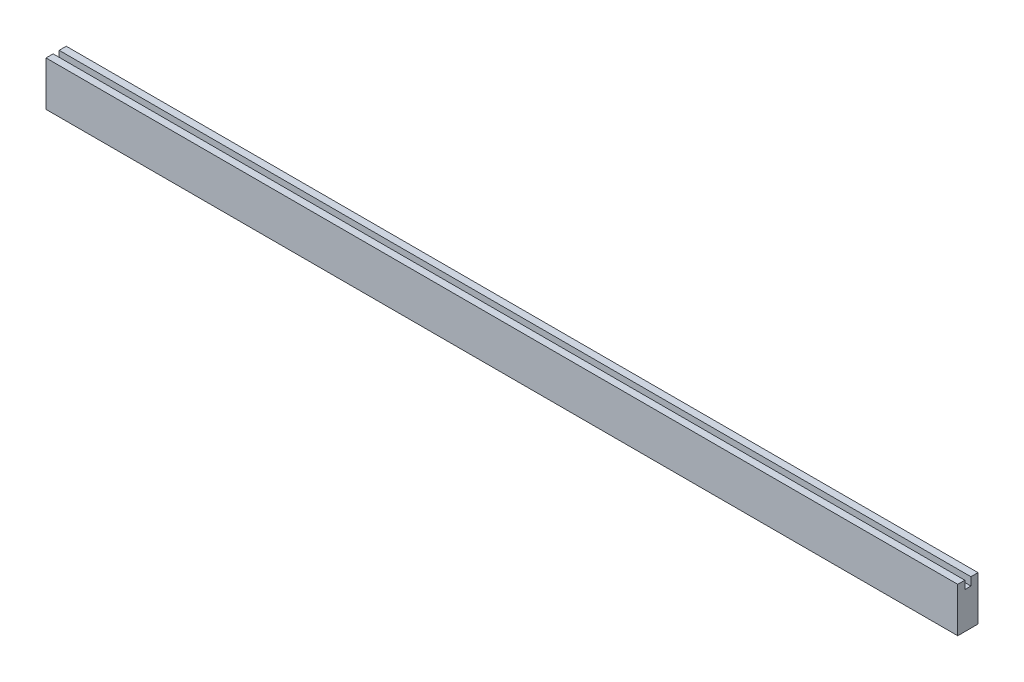
ISO-10303-21;
HEADER;
FILE_DESCRIPTION(('STEP AP214'),'2;1');
FILE_NAME('part.step','',(''),(''),'','','');
FILE_SCHEMA(('AUTOMOTIVE_DESIGN { 1 0 10303 214 1 1 1 1 }'));
ENDSEC;
DATA;
#1=APPLICATION_CONTEXT('core data for automotive mechanical design processes');
#2=APPLICATION_PROTOCOL_DEFINITION('international standard','automotive_design',2000,#1);
#3=PRODUCT_CONTEXT('',#1,'mechanical');
#4=PRODUCT('Part','Part','',(#3));
#5=PRODUCT_RELATED_PRODUCT_CATEGORY('part','',(#4));
#6=PRODUCT_DEFINITION_FORMATION('','',#4);
#7=PRODUCT_DEFINITION_CONTEXT('part definition',#1,'design');
#8=PRODUCT_DEFINITION('design','',#6,#7);
#9=PRODUCT_DEFINITION_SHAPE('','',#8);
#10=(LENGTH_UNIT() NAMED_UNIT(*) SI_UNIT(.MILLI.,.METRE.));
#11=(NAMED_UNIT(*) PLANE_ANGLE_UNIT() SI_UNIT($,.RADIAN.));
#12=(NAMED_UNIT(*) SI_UNIT($,.STERADIAN.) SOLID_ANGLE_UNIT());
#13=UNCERTAINTY_MEASURE_WITH_UNIT(LENGTH_MEASURE(1.E-05),#10,'distance_accuracy_value','');
#14=(GEOMETRIC_REPRESENTATION_CONTEXT(3) GLOBAL_UNCERTAINTY_ASSIGNED_CONTEXT((#13)) GLOBAL_UNIT_ASSIGNED_CONTEXT((#10,
#11,#12)) REPRESENTATION_CONTEXT('',''));
#15=CARTESIAN_POINT('',(0.,0.,0.));
#16=DIRECTION('',(0.,0.,1.));
#17=DIRECTION('',(1.,0.,0.));
#18=AXIS2_PLACEMENT_3D('',#15,#16,#17);
#19=CARTESIAN_POINT('',(0.,22.,0.));
#20=DIRECTION('',(0.,-1.,0.));
#21=DIRECTION('',(0.,0.,-1.));
#22=AXIS2_PLACEMENT_3D('',#19,#20,#21);
#23=PLANE('',#22);
#24=DIRECTION('',(0.,0.,1.));
#25=VECTOR('',#24,1.);
#26=CARTESIAN_POINT('',(-247.623576346524,22.,0.));
#27=LINE('',#26,#25);
#28=CARTESIAN_POINT('',(-247.623576346524,22.,-10.));
#29=VERTEX_POINT('',#28);
#30=CARTESIAN_POINT('',(-247.623576346524,22.,-6.5));
#31=VERTEX_POINT('',#30);
#32=EDGE_CURVE('E163',#29,#31,#27,.T.);
#33=ORIENTED_EDGE('',*,*,#32,.T.);
#34=DIRECTION('',(-1.,0.,0.));
#35=VECTOR('',#34,1.);
#36=CARTESIAN_POINT('',(-247.623576346524,22.,-6.5));
#37=LINE('',#36,#35);
#38=CARTESIAN_POINT('',(202.376423653476,22.,-6.5));
#39=VERTEX_POINT('',#38);
#40=EDGE_CURVE('E143',#39,#31,#37,.T.);
#41=ORIENTED_EDGE('',*,*,#40,.F.);
#42=DIRECTION('',(0.,0.,-1.));
#43=VECTOR('',#42,1.);
#44=CARTESIAN_POINT('',(202.376423653476,22.,0.));
#45=LINE('',#44,#43);
#46=CARTESIAN_POINT('',(202.376423653476,22.,-10.));
#47=VERTEX_POINT('',#46);
#48=EDGE_CURVE('E167',#39,#47,#45,.T.);
#49=ORIENTED_EDGE('',*,*,#48,.T.);
#50=DIRECTION('',(-1.,0.,0.));
#51=VECTOR('',#50,1.);
#52=CARTESIAN_POINT('',(-247.623576346524,22.,-10.));
#53=LINE('',#52,#51);
#54=EDGE_CURVE('E62',#47,#29,#53,.T.);
#55=ORIENTED_EDGE('',*,*,#54,.T.);
#56=EDGE_LOOP('',(#33,#41,#49,#55));
#57=FACE_BOUND('',#56,.T.);
#58=ADVANCED_FACE('F38',(#57),#23,.F.);
#59=CARTESIAN_POINT('',(-247.623576346524,22.,0.));
#60=DIRECTION('',(1.,0.,0.));
#61=DIRECTION('',(0.,0.,-1.));
#62=AXIS2_PLACEMENT_3D('',#59,#60,#61);
#63=PLANE('',#62);
#64=DIRECTION('',(0.,0.,1.));
#65=VECTOR('',#64,1.);
#66=CARTESIAN_POINT('',(-247.623576346524,18.,-6.5));
#67=LINE('',#66,#65);
#68=CARTESIAN_POINT('',(-247.623576346524,18.,-6.5));
#69=VERTEX_POINT('',#68);
#70=CARTESIAN_POINT('',(-247.623576346524,18.,-3.5));
#71=VERTEX_POINT('',#70);
#72=EDGE_CURVE('E139',#69,#71,#67,.T.);
#73=ORIENTED_EDGE('',*,*,#72,.F.);
#74=DIRECTION('',(0.,1.,0.));
#75=VECTOR('',#74,1.);
#76=CARTESIAN_POINT('',(-247.623576346524,18.,-6.5));
#77=LINE('',#76,#75);
#78=EDGE_CURVE('E153',#69,#31,#77,.T.);
#79=ORIENTED_EDGE('',*,*,#78,.T.);
#80=ORIENTED_EDGE('',*,*,#32,.F.);
#81=DIRECTION('',(0.,-1.,0.));
#82=VECTOR('',#81,1.);
#83=CARTESIAN_POINT('',(-247.623576346524,22.,-10.));
#84=LINE('',#83,#82);
#85=CARTESIAN_POINT('',(-247.623576346524,0.,-10.));
#86=VERTEX_POINT('',#85);
#87=EDGE_CURVE('E172',#29,#86,#84,.T.);
#88=ORIENTED_EDGE('',*,*,#87,.T.);
#89=DIRECTION('',(0.,0.,1.));
#90=VECTOR('',#89,1.);
#91=CARTESIAN_POINT('',(-247.623576346524,0.,0.));
#92=LINE('',#91,#90);
#93=CARTESIAN_POINT('',(-247.623576346524,0.,0.));
#94=VERTEX_POINT('',#93);
#95=EDGE_CURVE('E156',#86,#94,#92,.T.);
#96=ORIENTED_EDGE('',*,*,#95,.T.);
#97=DIRECTION('',(0.,-1.,0.));
#98=VECTOR('',#97,1.);
#99=CARTESIAN_POINT('',(-247.623576346524,22.,0.));
#100=LINE('',#99,#98);
#101=CARTESIAN_POINT('',(-247.623576346524,22.,0.));
#102=VERTEX_POINT('',#101);
#103=EDGE_CURVE('E11',#102,#94,#100,.T.);
#104=ORIENTED_EDGE('',*,*,#103,.F.);
#105=CARTESIAN_POINT('',(-247.623576346524,22.,-3.5));
#106=VERTEX_POINT('',#105);
#107=EDGE_CURVE('E90',#106,#102,#27,.T.);
#108=ORIENTED_EDGE('',*,*,#107,.F.);
#109=DIRECTION('',(0.,1.,0.));
#110=VECTOR('',#109,1.);
#111=CARTESIAN_POINT('',(-247.623576346524,18.,-3.5));
#112=LINE('',#111,#110);
#113=EDGE_CURVE('E53',#71,#106,#112,.T.);
#114=ORIENTED_EDGE('',*,*,#113,.F.);
#115=EDGE_LOOP('',(#73,#79,#80,#88,#96,#104,#108,#114));
#116=FACE_BOUND('',#115,.T.);
#117=ADVANCED_FACE('F40',(#116),#63,.F.);
#118=CARTESIAN_POINT('',(-247.623576346524,22.,0.));
#119=DIRECTION('',(0.,0.,-1.));
#120=DIRECTION('',(-1.,0.,0.));
#121=AXIS2_PLACEMENT_3D('',#118,#119,#120);
#122=PLANE('',#121);
#123=DIRECTION('',(1.,0.,0.));
#124=VECTOR('',#123,1.);
#125=CARTESIAN_POINT('',(-247.623576346524,0.,0.));
#126=LINE('',#125,#124);
#127=CARTESIAN_POINT('',(202.376423653476,0.,0.));
#128=VERTEX_POINT('',#127);
#129=EDGE_CURVE('E175',#94,#128,#126,.T.);
#130=ORIENTED_EDGE('',*,*,#129,.T.);
#131=DIRECTION('',(0.,-1.,0.));
#132=VECTOR('',#131,1.);
#133=CARTESIAN_POINT('',(202.376423653476,22.,0.));
#134=LINE('',#133,#132);
#135=CARTESIAN_POINT('',(202.376423653476,22.,0.));
#136=VERTEX_POINT('',#135);
#137=EDGE_CURVE('E46',#136,#128,#134,.T.);
#138=ORIENTED_EDGE('',*,*,#137,.F.);
#139=DIRECTION('',(1.,0.,0.));
#140=VECTOR('',#139,1.);
#141=CARTESIAN_POINT('',(-247.623576346524,22.,0.));
#142=LINE('',#141,#140);
#143=EDGE_CURVE('E165',#102,#136,#142,.T.);
#144=ORIENTED_EDGE('',*,*,#143,.F.);
#145=ORIENTED_EDGE('',*,*,#103,.T.);
#146=EDGE_LOOP('',(#130,#138,#144,#145));
#147=FACE_BOUND('',#146,.T.);
#148=ADVANCED_FACE('F208',(#147),#122,.F.);
#149=CARTESIAN_POINT('',(202.376423653476,22.,0.));
#150=DIRECTION('',(-1.,0.,0.));
#151=DIRECTION('',(0.,0.,1.));
#152=AXIS2_PLACEMENT_3D('',#149,#150,#151);
#153=PLANE('',#152);
#154=ORIENTED_EDGE('',*,*,#48,.F.);
#155=DIRECTION('',(0.,1.,0.));
#156=VECTOR('',#155,1.);
#157=CARTESIAN_POINT('',(202.376423653476,18.,-6.5));
#158=LINE('',#157,#156);
#159=CARTESIAN_POINT('',(202.376423653476,18.,-6.5));
#160=VERTEX_POINT('',#159);
#161=EDGE_CURVE('E157',#160,#39,#158,.T.);
#162=ORIENTED_EDGE('',*,*,#161,.F.);
#163=DIRECTION('',(0.,0.,-1.));
#164=VECTOR('',#163,1.);
#165=CARTESIAN_POINT('',(202.376423653476,18.,-6.5));
#166=LINE('',#165,#164);
#167=CARTESIAN_POINT('',(202.376423653476,18.,-3.5));
#168=VERTEX_POINT('',#167);
#169=EDGE_CURVE('E146',#168,#160,#166,.T.);
#170=ORIENTED_EDGE('',*,*,#169,.F.);
#171=DIRECTION('',(0.,1.,0.));
#172=VECTOR('',#171,1.);
#173=CARTESIAN_POINT('',(202.376423653476,18.,-3.5));
#174=LINE('',#173,#172);
#175=CARTESIAN_POINT('',(202.376423653476,22.,-3.5));
#176=VERTEX_POINT('',#175);
#177=EDGE_CURVE('E159',#168,#176,#174,.T.);
#178=ORIENTED_EDGE('',*,*,#177,.T.);
#179=EDGE_CURVE('E168',#136,#176,#45,.T.);
#180=ORIENTED_EDGE('',*,*,#179,.F.);
#181=ORIENTED_EDGE('',*,*,#137,.T.);
#182=DIRECTION('',(0.,0.,-1.));
#183=VECTOR('',#182,1.);
#184=CARTESIAN_POINT('',(202.376423653476,0.,0.));
#185=LINE('',#184,#183);
#186=CARTESIAN_POINT('',(202.376423653476,0.,-10.));
#187=VERTEX_POINT('',#186);
#188=EDGE_CURVE('E177',#128,#187,#185,.T.);
#189=ORIENTED_EDGE('',*,*,#188,.T.);
#190=DIRECTION('',(0.,-1.,0.));
#191=VECTOR('',#190,1.);
#192=CARTESIAN_POINT('',(202.376423653476,22.,-10.));
#193=LINE('',#192,#191);
#194=EDGE_CURVE('E181',#47,#187,#193,.T.);
#195=ORIENTED_EDGE('',*,*,#194,.F.);
#196=EDGE_LOOP('',(#154,#162,#170,#178,#180,#181,#189,#195));
#197=FACE_BOUND('',#196,.T.);
#198=ADVANCED_FACE('F188',(#197),#153,.F.);
#199=CARTESIAN_POINT('',(-247.623576346524,22.,-10.));
#200=DIRECTION('',(0.,0.,1.));
#201=DIRECTION('',(1.,0.,0.));
#202=AXIS2_PLACEMENT_3D('',#199,#200,#201);
#203=PLANE('',#202);
#204=DIRECTION('',(-1.,0.,0.));
#205=VECTOR('',#204,1.);
#206=CARTESIAN_POINT('',(-247.623576346524,0.,-10.));
#207=LINE('',#206,#205);
#208=EDGE_CURVE('E83',#187,#86,#207,.T.);
#209=ORIENTED_EDGE('',*,*,#208,.T.);
#210=ORIENTED_EDGE('',*,*,#87,.F.);
#211=ORIENTED_EDGE('',*,*,#54,.F.);
#212=ORIENTED_EDGE('',*,*,#194,.T.);
#213=EDGE_LOOP('',(#209,#210,#211,#212));
#214=FACE_BOUND('',#213,.T.);
#215=ADVANCED_FACE('F198',(#214),#203,.F.);
#216=ORIENTED_EDGE('',*,*,#179,.T.);
#217=DIRECTION('',(1.,0.,0.));
#218=VECTOR('',#217,1.);
#219=CARTESIAN_POINT('',(-247.623576346524,22.,-3.5));
#220=LINE('',#219,#218);
#221=EDGE_CURVE('E138',#106,#176,#220,.T.);
#222=ORIENTED_EDGE('',*,*,#221,.F.);
#223=ORIENTED_EDGE('',*,*,#107,.T.);
#224=ORIENTED_EDGE('',*,*,#143,.T.);
#225=EDGE_LOOP('',(#216,#222,#223,#224));
#226=FACE_BOUND('',#225,.T.);
#227=ADVANCED_FACE('F207',(#226),#23,.F.);
#228=CARTESIAN_POINT('',(0.,0.,0.));
#229=DIRECTION('',(0.,-1.,0.));
#230=DIRECTION('',(0.,0.,-1.));
#231=AXIS2_PLACEMENT_3D('',#228,#229,#230);
#232=PLANE('',#231);
#233=CARTESIAN_POINT('',(77.3764236534756,0.,-4.99999999999978));
#234=DIRECTION('',(0.,-1.,0.));
#235=DIRECTION('',(0.,0.,-1.));
#236=AXIS2_PLACEMENT_3D('',#233,#234,#235);
#237=CIRCLE('',#236,1.49999999999999);
#238=CARTESIAN_POINT('',(77.3764236534756,0.,-6.49999999999977));
#239=VERTEX_POINT('',#238);
#240=EDGE_CURVE('E128',#239,#239,#237,.T.);
#241=ORIENTED_EDGE('',*,*,#240,.F.);
#242=EDGE_LOOP('',(#241));
#243=FACE_BOUND('',#242,.T.);
#244=CARTESIAN_POINT('',(-122.623576346524,0.,-4.99999999999978));
#245=DIRECTION('',(0.,-1.,0.));
#246=DIRECTION('',(0.,0.,-1.));
#247=AXIS2_PLACEMENT_3D('',#244,#245,#246);
#248=CIRCLE('',#247,1.49999999999999);
#249=CARTESIAN_POINT('',(-122.623576346524,0.,-6.49999999999977));
#250=VERTEX_POINT('',#249);
#251=EDGE_CURVE('E127',#250,#250,#248,.T.);
#252=ORIENTED_EDGE('',*,*,#251,.F.);
#253=EDGE_LOOP('',(#252));
#254=FACE_BOUND('',#253,.T.);
#255=ORIENTED_EDGE('',*,*,#95,.F.);
#256=ORIENTED_EDGE('',*,*,#208,.F.);
#257=ORIENTED_EDGE('',*,*,#188,.F.);
#258=ORIENTED_EDGE('',*,*,#129,.F.);
#259=EDGE_LOOP('',(#255,#256,#257,#258));
#260=FACE_BOUND('',#259,.T.);
#261=ADVANCED_FACE('F193',(#243,#254,#260),#232,.T.);
#262=CARTESIAN_POINT('',(-247.623576346524,18.,-6.5));
#263=DIRECTION('',(0.,0.,-1.));
#264=DIRECTION('',(-1.,0.,0.));
#265=AXIS2_PLACEMENT_3D('',#262,#263,#264);
#266=PLANE('',#265);
#267=ORIENTED_EDGE('',*,*,#40,.T.);
#268=ORIENTED_EDGE('',*,*,#78,.F.);
#269=DIRECTION('',(-1.,0.,0.));
#270=VECTOR('',#269,1.);
#271=CARTESIAN_POINT('',(-247.623576346524,18.,-6.5));
#272=LINE('',#271,#270);
#273=EDGE_CURVE('E148',#160,#69,#272,.T.);
#274=ORIENTED_EDGE('',*,*,#273,.F.);
#275=ORIENTED_EDGE('',*,*,#161,.T.);
#276=EDGE_LOOP('',(#267,#268,#274,#275));
#277=FACE_BOUND('',#276,.T.);
#278=ADVANCED_FACE('F203',(#277),#266,.F.);
#279=CARTESIAN_POINT('',(-247.623576346524,18.,-3.5));
#280=DIRECTION('',(0.,0.,1.));
#281=DIRECTION('',(1.,0.,0.));
#282=AXIS2_PLACEMENT_3D('',#279,#280,#281);
#283=PLANE('',#282);
#284=ORIENTED_EDGE('',*,*,#221,.T.);
#285=ORIENTED_EDGE('',*,*,#177,.F.);
#286=DIRECTION('',(1.,0.,0.));
#287=VECTOR('',#286,1.);
#288=CARTESIAN_POINT('',(-247.623576346524,18.,-3.5));
#289=LINE('',#288,#287);
#290=EDGE_CURVE('E142',#71,#168,#289,.T.);
#291=ORIENTED_EDGE('',*,*,#290,.F.);
#292=ORIENTED_EDGE('',*,*,#113,.T.);
#293=EDGE_LOOP('',(#284,#285,#291,#292));
#294=FACE_BOUND('',#293,.T.);
#295=ADVANCED_FACE('F252',(#294),#283,.F.);
#296=CARTESIAN_POINT('',(0.,18.,0.));
#297=DIRECTION('',(0.,1.,0.));
#298=DIRECTION('',(0.,0.,1.));
#299=AXIS2_PLACEMENT_3D('',#296,#297,#298);
#300=PLANE('',#299);
#301=ORIENTED_EDGE('',*,*,#72,.T.);
#302=ORIENTED_EDGE('',*,*,#290,.T.);
#303=ORIENTED_EDGE('',*,*,#169,.T.);
#304=ORIENTED_EDGE('',*,*,#273,.T.);
#305=EDGE_LOOP('',(#301,#302,#303,#304));
#306=FACE_BOUND('',#305,.T.);
#307=ADVANCED_FACE('F206',(#306),#300,.T.);
#308=CARTESIAN_POINT('',(-122.623576346524,10.,-4.99999999999978));
#309=DIRECTION('',(0.,-1.,0.));
#310=DIRECTION('',(0.,0.,-1.));
#311=AXIS2_PLACEMENT_3D('',#308,#309,#310);
#312=CONICAL_SURFACE('',#311,1.5,1.02974425867666);
#313=CARTESIAN_POINT('',(-122.623576346524,10.9012909285413,-4.99999999999978));
#314=VERTEX_POINT('',#313);
#315=VERTEX_LOOP('',#314);
#316=FACE_BOUND('',#315,.T.);
#317=CARTESIAN_POINT('',(-122.623576346524,10.,-4.99999999999978));
#318=DIRECTION('',(0.,-1.,0.));
#319=DIRECTION('',(0.,0.,-1.));
#320=AXIS2_PLACEMENT_3D('',#317,#318,#319);
#321=CIRCLE('',#320,1.5);
#322=CARTESIAN_POINT('',(-122.623576346524,10.,-6.49999999999978));
#323=VERTEX_POINT('',#322);
#324=EDGE_CURVE('E131',#323,#323,#321,.T.);
#325=ORIENTED_EDGE('',*,*,#324,.T.);
#326=EDGE_LOOP('',(#325));
#327=FACE_BOUND('',#326,.T.);
#328=ADVANCED_FACE('F269',(#316,#327),#312,.F.);
#329=CARTESIAN_POINT('',(-122.623576346524,0.,-4.99999999999978));
#330=DIRECTION('',(0.,-1.,0.));
#331=DIRECTION('',(0.,0.,-1.));
#332=AXIS2_PLACEMENT_3D('',#329,#330,#331);
#333=CYLINDRICAL_SURFACE('',#332,1.49999999999999);
#334=ORIENTED_EDGE('',*,*,#324,.F.);
#335=EDGE_LOOP('',(#334));
#336=FACE_BOUND('',#335,.T.);
#337=ORIENTED_EDGE('',*,*,#251,.T.);
#338=EDGE_LOOP('',(#337));
#339=FACE_BOUND('',#338,.T.);
#340=ADVANCED_FACE('F121',(#336,#339),#333,.F.);
#341=CARTESIAN_POINT('',(77.3764236534756,10.,-4.99999999999978));
#342=DIRECTION('',(0.,-1.,0.));
#343=DIRECTION('',(0.,0.,-1.));
#344=AXIS2_PLACEMENT_3D('',#341,#342,#343);
#345=CONICAL_SURFACE('',#344,1.5,1.02974425867666);
#346=CARTESIAN_POINT('',(77.3764236534756,10.9012909285413,-4.99999999999978));
#347=VERTEX_POINT('',#346);
#348=VERTEX_LOOP('',#347);
#349=FACE_BOUND('',#348,.T.);
#350=CARTESIAN_POINT('',(77.3764236534756,10.,-4.99999999999978));
#351=DIRECTION('',(0.,-1.,0.));
#352=DIRECTION('',(0.,0.,-1.));
#353=AXIS2_PLACEMENT_3D('',#350,#351,#352);
#354=CIRCLE('',#353,1.5);
#355=CARTESIAN_POINT('',(77.3764236534756,10.,-6.49999999999978));
#356=VERTEX_POINT('',#355);
#357=EDGE_CURVE('E125',#356,#356,#354,.T.);
#358=ORIENTED_EDGE('',*,*,#357,.T.);
#359=EDGE_LOOP('',(#358));
#360=FACE_BOUND('',#359,.T.);
#361=ADVANCED_FACE('F117',(#349,#360),#345,.F.);
#362=CARTESIAN_POINT('',(77.3764236534756,0.,-4.99999999999978));
#363=DIRECTION('',(0.,-1.,0.));
#364=DIRECTION('',(0.,0.,-1.));
#365=AXIS2_PLACEMENT_3D('',#362,#363,#364);
#366=CYLINDRICAL_SURFACE('',#365,1.49999999999999);
#367=ORIENTED_EDGE('',*,*,#357,.F.);
#368=EDGE_LOOP('',(#367));
#369=FACE_BOUND('',#368,.T.);
#370=ORIENTED_EDGE('',*,*,#240,.T.);
#371=EDGE_LOOP('',(#370));
#372=FACE_BOUND('',#371,.T.);
#373=ADVANCED_FACE('F120',(#369,#372),#366,.F.);
#374=CLOSED_SHELL('',(#58,#117,#148,#198,#215,#227,#261,#278,#295,#307,#328,#340,#361,#373));
#375=MANIFOLD_SOLID_BREP('B2',#374);
#376=ADVANCED_BREP_SHAPE_REPRESENTATION('',(#18,#375),#14);
#377=SHAPE_DEFINITION_REPRESENTATION(#9,#376);
ENDSEC;
END-ISO-10303-21;
